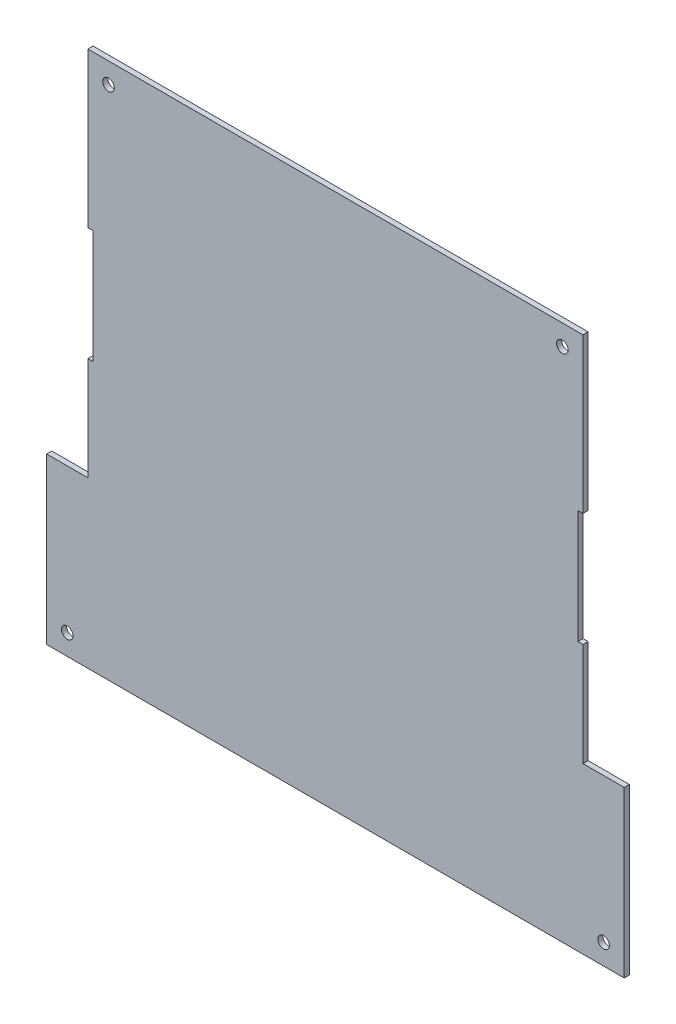
ISO-10303-21;
HEADER;
FILE_DESCRIPTION(('STEP AP214'),'2;1');
FILE_NAME('part.step','',(''),(''),'','','');
FILE_SCHEMA(('AUTOMOTIVE_DESIGN { 1 0 10303 214 1 1 1 1 }'));
ENDSEC;
DATA;
#1=APPLICATION_CONTEXT('core data for automotive mechanical design processes');
#2=APPLICATION_PROTOCOL_DEFINITION('international standard','automotive_design',2000,#1);
#3=PRODUCT_CONTEXT('',#1,'mechanical');
#4=PRODUCT('Part','Part','',(#3));
#5=PRODUCT_RELATED_PRODUCT_CATEGORY('part','',(#4));
#6=PRODUCT_DEFINITION_FORMATION('','',#4);
#7=PRODUCT_DEFINITION_CONTEXT('part definition',#1,'design');
#8=PRODUCT_DEFINITION('design','',#6,#7);
#9=PRODUCT_DEFINITION_SHAPE('','',#8);
#10=(LENGTH_UNIT() NAMED_UNIT(*) SI_UNIT(.MILLI.,.METRE.));
#11=(NAMED_UNIT(*) PLANE_ANGLE_UNIT() SI_UNIT($,.RADIAN.));
#12=(NAMED_UNIT(*) SI_UNIT($,.STERADIAN.) SOLID_ANGLE_UNIT());
#13=UNCERTAINTY_MEASURE_WITH_UNIT(LENGTH_MEASURE(1.E-05),#10,'distance_accuracy_value','');
#14=(GEOMETRIC_REPRESENTATION_CONTEXT(3) GLOBAL_UNCERTAINTY_ASSIGNED_CONTEXT((#13)) GLOBAL_UNIT_ASSIGNED_CONTEXT((#10,
#11,#12)) REPRESENTATION_CONTEXT('',''));
#15=CARTESIAN_POINT('',(0.,0.,0.));
#16=DIRECTION('',(0.,0.,1.));
#17=DIRECTION('',(1.,0.,0.));
#18=AXIS2_PLACEMENT_3D('',#15,#16,#17);
#19=CARTESIAN_POINT('',(0.,0.,3.175));
#20=DIRECTION('',(1.,0.,0.));
#21=DIRECTION('',(0.,1.,0.));
#22=AXIS2_PLACEMENT_3D('',#19,#20,#21);
#23=PLANE('',#22);
#24=DIRECTION('',(0.,-1.,0.));
#25=VECTOR('',#24,1.);
#26=CARTESIAN_POINT('',(0.,0.,0.));
#27=LINE('',#26,#25);
#28=CARTESIAN_POINT('',(0.,0.,0.));
#29=VERTEX_POINT('',#28);
#30=CARTESIAN_POINT('',(0.,-95.25,0.));
#31=VERTEX_POINT('',#30);
#32=EDGE_CURVE('E341',#29,#31,#27,.T.);
#33=ORIENTED_EDGE('',*,*,#32,.T.);
#34=DIRECTION('',(0.,0.,1.));
#35=VECTOR('',#34,1.);
#36=CARTESIAN_POINT('',(0.,-95.25,-0.00100000000000013));
#37=LINE('',#36,#35);
#38=CARTESIAN_POINT('',(0.,-95.25,3.175));
#39=VERTEX_POINT('',#38);
#40=EDGE_CURVE('E264',#31,#39,#37,.T.);
#41=ORIENTED_EDGE('',*,*,#40,.T.);
#42=DIRECTION('',(0.,-1.,0.));
#43=VECTOR('',#42,1.);
#44=CARTESIAN_POINT('',(0.,0.,3.175));
#45=LINE('',#44,#43);
#46=CARTESIAN_POINT('',(0.,0.,3.175));
#47=VERTEX_POINT('',#46);
#48=EDGE_CURVE('E328',#47,#39,#45,.T.);
#49=ORIENTED_EDGE('',*,*,#48,.F.);
#50=DIRECTION('',(0.,0.,-1.));
#51=VECTOR('',#50,1.);
#52=CARTESIAN_POINT('',(0.,0.,3.175));
#53=LINE('',#52,#51);
#54=EDGE_CURVE('E60',#47,#29,#53,.T.);
#55=ORIENTED_EDGE('',*,*,#54,.T.);
#56=EDGE_LOOP('',(#33,#41,#49,#55));
#57=FACE_BOUND('',#56,.T.);
#58=ADVANCED_FACE('F51',(#57),#23,.F.);
#59=CARTESIAN_POINT('',(304.8,0.,3.175));
#60=DIRECTION('',(-1.,0.,0.));
#61=DIRECTION('',(0.,-1.,0.));
#62=AXIS2_PLACEMENT_3D('',#59,#60,#61);
#63=PLANE('',#62);
#64=DIRECTION('',(0.,1.,0.));
#65=VECTOR('',#64,1.);
#66=CARTESIAN_POINT('',(304.8,0.,3.175));
#67=LINE('',#66,#65);
#68=CARTESIAN_POINT('',(304.8,-228.6,3.175));
#69=VERTEX_POINT('',#68);
#70=CARTESIAN_POINT('',(304.8,-165.1,3.175));
#71=VERTEX_POINT('',#70);
#72=EDGE_CURVE('E67',#69,#71,#67,.T.);
#73=ORIENTED_EDGE('',*,*,#72,.F.);
#74=DIRECTION('',(0.,0.,1.));
#75=VECTOR('',#74,1.);
#76=CARTESIAN_POINT('',(304.8,-228.6,-104.726882890689));
#77=LINE('',#76,#75);
#78=CARTESIAN_POINT('',(304.8,-228.6,0.));
#79=VERTEX_POINT('',#78);
#80=EDGE_CURVE('E230',#79,#69,#77,.T.);
#81=ORIENTED_EDGE('',*,*,#80,.F.);
#82=DIRECTION('',(0.,1.,0.));
#83=VECTOR('',#82,1.);
#84=CARTESIAN_POINT('',(304.8,0.,0.));
#85=LINE('',#84,#83);
#86=CARTESIAN_POINT('',(304.8,-165.1,0.));
#87=VERTEX_POINT('',#86);
#88=EDGE_CURVE('E349',#79,#87,#85,.T.);
#89=ORIENTED_EDGE('',*,*,#88,.T.);
#90=DIRECTION('',(0.,0.,1.));
#91=VECTOR('',#90,1.);
#92=CARTESIAN_POINT('',(304.8,-165.1,-0.00100000000000013));
#93=LINE('',#92,#91);
#94=EDGE_CURVE('E282',#87,#71,#93,.T.);
#95=ORIENTED_EDGE('',*,*,#94,.T.);
#96=EDGE_LOOP('',(#73,#81,#89,#95));
#97=FACE_BOUND('',#96,.T.);
#98=ADVANCED_FACE('F515',(#97),#63,.F.);
#99=CARTESIAN_POINT('',(0.,-165.1,0.));
#100=VERTEX_POINT('',#99);
#101=CARTESIAN_POINT('',(0.,-228.6,0.));
#102=VERTEX_POINT('',#101);
#103=EDGE_CURVE('E327',#100,#102,#27,.T.);
#104=ORIENTED_EDGE('',*,*,#103,.T.);
#105=DIRECTION('',(0.,0.,1.));
#106=VECTOR('',#105,1.);
#107=CARTESIAN_POINT('',(0.,-228.6,-104.726882890689));
#108=LINE('',#107,#106);
#109=CARTESIAN_POINT('',(0.,-228.6,3.175));
#110=VERTEX_POINT('',#109);
#111=EDGE_CURVE('E75',#102,#110,#108,.T.);
#112=ORIENTED_EDGE('',*,*,#111,.T.);
#113=CARTESIAN_POINT('',(0.,-165.1,3.175));
#114=VERTEX_POINT('',#113);
#115=EDGE_CURVE('E202',#114,#110,#45,.T.);
#116=ORIENTED_EDGE('',*,*,#115,.F.);
#117=DIRECTION('',(0.,0.,1.));
#118=VECTOR('',#117,1.);
#119=CARTESIAN_POINT('',(0.,-165.1,-0.00100000000000013));
#120=LINE('',#119,#118);
#121=EDGE_CURVE('E263',#100,#114,#120,.T.);
#122=ORIENTED_EDGE('',*,*,#121,.F.);
#123=EDGE_LOOP('',(#104,#112,#116,#122));
#124=FACE_BOUND('',#123,.T.);
#125=ADVANCED_FACE('F53',(#124),#23,.F.);
#126=CARTESIAN_POINT('',(0.,-330.2,3.175));
#127=DIRECTION('',(0.,1.,0.));
#128=DIRECTION('',(0.,0.,1.));
#129=AXIS2_PLACEMENT_3D('',#126,#127,#128);
#130=PLANE('',#129);
#131=DIRECTION('',(1.,0.,0.));
#132=VECTOR('',#131,1.);
#133=CARTESIAN_POINT('',(0.,-330.2,0.));
#134=LINE('',#133,#132);
#135=CARTESIAN_POINT('',(-25.4,-330.2,0.));
#136=VERTEX_POINT('',#135);
#137=CARTESIAN_POINT('',(330.2,-330.2,0.));
#138=VERTEX_POINT('',#137);
#139=EDGE_CURVE('E345',#136,#138,#134,.T.);
#140=ORIENTED_EDGE('',*,*,#139,.T.);
#141=DIRECTION('',(0.,0.,1.));
#142=VECTOR('',#141,1.);
#143=CARTESIAN_POINT('',(330.2,-330.2,-104.726882890689));
#144=LINE('',#143,#142);
#145=CARTESIAN_POINT('',(330.2,-330.2,3.175));
#146=VERTEX_POINT('',#145);
#147=EDGE_CURVE('E223',#138,#146,#144,.T.);
#148=ORIENTED_EDGE('',*,*,#147,.T.);
#149=DIRECTION('',(1.,0.,0.));
#150=VECTOR('',#149,1.);
#151=CARTESIAN_POINT('',(0.,-330.2,3.175));
#152=LINE('',#151,#150);
#153=CARTESIAN_POINT('',(-25.4,-330.2,3.175));
#154=VERTEX_POINT('',#153);
#155=EDGE_CURVE('E332',#154,#146,#152,.T.);
#156=ORIENTED_EDGE('',*,*,#155,.F.);
#157=DIRECTION('',(0.,0.,1.));
#158=VECTOR('',#157,1.);
#159=CARTESIAN_POINT('',(-25.4,-330.2,-104.726882890689));
#160=LINE('',#159,#158);
#161=EDGE_CURVE('E188',#136,#154,#160,.T.);
#162=ORIENTED_EDGE('',*,*,#161,.F.);
#163=EDGE_LOOP('',(#140,#148,#156,#162));
#164=FACE_BOUND('',#163,.T.);
#165=ADVANCED_FACE('F523',(#164),#130,.F.);
#166=CARTESIAN_POINT('',(304.8,-95.25,3.175));
#167=VERTEX_POINT('',#166);
#168=CARTESIAN_POINT('',(304.8,0.,3.175));
#169=VERTEX_POINT('',#168);
#170=EDGE_CURVE('E335',#167,#169,#67,.T.);
#171=ORIENTED_EDGE('',*,*,#170,.F.);
#172=DIRECTION('',(0.,0.,1.));
#173=VECTOR('',#172,1.);
#174=CARTESIAN_POINT('',(304.8,-95.25,-0.00100000000000013));
#175=LINE('',#174,#173);
#176=CARTESIAN_POINT('',(304.8,-95.25,0.));
#177=VERTEX_POINT('',#176);
#178=EDGE_CURVE('E283',#177,#167,#175,.T.);
#179=ORIENTED_EDGE('',*,*,#178,.F.);
#180=CARTESIAN_POINT('',(304.8,0.,0.));
#181=VERTEX_POINT('',#180);
#182=EDGE_CURVE('E348',#177,#181,#85,.T.);
#183=ORIENTED_EDGE('',*,*,#182,.T.);
#184=DIRECTION('',(0.,0.,-1.));
#185=VECTOR('',#184,1.);
#186=CARTESIAN_POINT('',(304.8,0.,3.175));
#187=LINE('',#186,#185);
#188=EDGE_CURVE('E11',#169,#181,#187,.T.);
#189=ORIENTED_EDGE('',*,*,#188,.F.);
#190=EDGE_LOOP('',(#171,#179,#183,#189));
#191=FACE_BOUND('',#190,.T.);
#192=ADVANCED_FACE('F379',(#191),#63,.F.);
#193=CARTESIAN_POINT('',(0.,0.,3.175));
#194=DIRECTION('',(0.,-1.,0.));
#195=DIRECTION('',(0.,0.,-1.));
#196=AXIS2_PLACEMENT_3D('',#193,#194,#195);
#197=PLANE('',#196);
#198=DIRECTION('',(-1.,0.,0.));
#199=VECTOR('',#198,1.);
#200=CARTESIAN_POINT('',(0.,0.,0.));
#201=LINE('',#200,#199);
#202=EDGE_CURVE('E352',#181,#29,#201,.T.);
#203=ORIENTED_EDGE('',*,*,#202,.T.);
#204=ORIENTED_EDGE('',*,*,#54,.F.);
#205=DIRECTION('',(-1.,0.,0.));
#206=VECTOR('',#205,1.);
#207=CARTESIAN_POINT('',(0.,0.,3.175));
#208=LINE('',#207,#206);
#209=EDGE_CURVE('E338',#169,#47,#208,.T.);
#210=ORIENTED_EDGE('',*,*,#209,.F.);
#211=ORIENTED_EDGE('',*,*,#188,.T.);
#212=EDGE_LOOP('',(#203,#204,#210,#211));
#213=FACE_BOUND('',#212,.T.);
#214=ADVANCED_FACE('F377',(#213),#197,.F.);
#215=CARTESIAN_POINT('',(0.,0.,3.175));
#216=DIRECTION('',(0.,0.,1.));
#217=DIRECTION('',(1.,0.,0.));
#218=AXIS2_PLACEMENT_3D('',#215,#216,#217);
#219=PLANE('',#218);
#220=CARTESIAN_POINT('',(-12.7,-317.5,3.175));
#221=DIRECTION('',(0.,0.,1.));
#222=DIRECTION('',(1.,0.,0.));
#223=AXIS2_PLACEMENT_3D('',#220,#221,#222);
#224=CIRCLE('',#223,3.57123999999999);
#225=CARTESIAN_POINT('',(-9.12876000000001,-317.5,3.175));
#226=VERTEX_POINT('',#225);
#227=EDGE_CURVE('E484',#226,#226,#224,.T.);
#228=ORIENTED_EDGE('',*,*,#227,.F.);
#229=EDGE_LOOP('',(#228));
#230=FACE_BOUND('',#229,.T.);
#231=CARTESIAN_POINT('',(317.5,-317.5,3.175));
#232=DIRECTION('',(0.,0.,1.));
#233=DIRECTION('',(1.,0.,0.));
#234=AXIS2_PLACEMENT_3D('',#231,#232,#233);
#235=CIRCLE('',#234,3.57123999999998);
#236=CARTESIAN_POINT('',(321.07124,-317.5,3.175));
#237=VERTEX_POINT('',#236);
#238=EDGE_CURVE('E473',#237,#237,#235,.T.);
#239=ORIENTED_EDGE('',*,*,#238,.F.);
#240=EDGE_LOOP('',(#239));
#241=FACE_BOUND('',#240,.T.);
#242=DIRECTION('',(-1.,0.,0.));
#243=VECTOR('',#242,1.);
#244=CARTESIAN_POINT('',(3.17500000000001,-95.25,3.175));
#245=LINE('',#244,#243);
#246=CARTESIAN_POINT('',(3.17500000000001,-95.25,3.175));
#247=VERTEX_POINT('',#246);
#248=EDGE_CURVE('E260',#247,#39,#245,.T.);
#249=ORIENTED_EDGE('',*,*,#248,.F.);
#250=DIRECTION('',(0.,1.,0.));
#251=VECTOR('',#250,1.);
#252=CARTESIAN_POINT('',(3.17500000000001,-165.1,3.175));
#253=LINE('',#252,#251);
#254=CARTESIAN_POINT('',(3.17500000000001,-165.1,3.175));
#255=VERTEX_POINT('',#254);
#256=EDGE_CURVE('E256',#255,#247,#253,.T.);
#257=ORIENTED_EDGE('',*,*,#256,.F.);
#258=DIRECTION('',(1.,0.,0.));
#259=VECTOR('',#258,1.);
#260=CARTESIAN_POINT('',(3.17500000000001,-165.1,3.175));
#261=LINE('',#260,#259);
#262=EDGE_CURVE('E252',#114,#255,#261,.T.);
#263=ORIENTED_EDGE('',*,*,#262,.F.);
#264=ORIENTED_EDGE('',*,*,#115,.T.);
#265=DIRECTION('',(-1.,0.,0.));
#266=VECTOR('',#265,1.);
#267=CARTESIAN_POINT('',(0.,-228.6,3.175));
#268=LINE('',#267,#266);
#269=CARTESIAN_POINT('',(-25.4,-228.6,3.175));
#270=VERTEX_POINT('',#269);
#271=EDGE_CURVE('E182',#110,#270,#268,.T.);
#272=ORIENTED_EDGE('',*,*,#271,.T.);
#273=DIRECTION('',(0.,-1.,0.));
#274=VECTOR('',#273,1.);
#275=CARTESIAN_POINT('',(-25.4,-330.2,3.175));
#276=LINE('',#275,#274);
#277=EDGE_CURVE('E192',#270,#154,#276,.T.);
#278=ORIENTED_EDGE('',*,*,#277,.T.);
#279=ORIENTED_EDGE('',*,*,#155,.T.);
#280=DIRECTION('',(0.,1.,0.));
#281=VECTOR('',#280,1.);
#282=CARTESIAN_POINT('',(330.2,-330.2,3.175));
#283=LINE('',#282,#281);
#284=CARTESIAN_POINT('',(330.2,-228.6,3.175));
#285=VERTEX_POINT('',#284);
#286=EDGE_CURVE('E204',#146,#285,#283,.T.);
#287=ORIENTED_EDGE('',*,*,#286,.T.);
#288=DIRECTION('',(-1.,0.,0.));
#289=VECTOR('',#288,1.);
#290=CARTESIAN_POINT('',(304.8,-228.6,3.175));
#291=LINE('',#290,#289);
#292=EDGE_CURVE('E210',#285,#69,#291,.T.);
#293=ORIENTED_EDGE('',*,*,#292,.T.);
#294=ORIENTED_EDGE('',*,*,#72,.T.);
#295=DIRECTION('',(1.,0.,0.));
#296=VECTOR('',#295,1.);
#297=CARTESIAN_POINT('',(301.625,-165.1,3.175));
#298=LINE('',#297,#296);
#299=CARTESIAN_POINT('',(301.625,-165.1,3.175));
#300=VERTEX_POINT('',#299);
#301=EDGE_CURVE('E286',#300,#71,#298,.T.);
#302=ORIENTED_EDGE('',*,*,#301,.F.);
#303=DIRECTION('',(0.,-1.,0.));
#304=VECTOR('',#303,1.);
#305=CARTESIAN_POINT('',(301.625,-165.1,3.175));
#306=LINE('',#305,#304);
#307=CARTESIAN_POINT('',(301.625,-95.25,3.175));
#308=VERTEX_POINT('',#307);
#309=EDGE_CURVE('E298',#308,#300,#306,.T.);
#310=ORIENTED_EDGE('',*,*,#309,.F.);
#311=DIRECTION('',(-1.,0.,0.));
#312=VECTOR('',#311,1.);
#313=CARTESIAN_POINT('',(301.625,-95.25,3.175));
#314=LINE('',#313,#312);
#315=EDGE_CURVE('E302',#167,#308,#314,.T.);
#316=ORIENTED_EDGE('',*,*,#315,.F.);
#317=ORIENTED_EDGE('',*,*,#170,.T.);
#318=ORIENTED_EDGE('',*,*,#209,.T.);
#319=ORIENTED_EDGE('',*,*,#48,.T.);
#320=EDGE_LOOP('',(#249,#257,#263,#264,#272,#278,#279,#287,#293,#294,#302,#310,#316,#317,#318,#319));
#321=FACE_BOUND('',#320,.T.);
#322=CARTESIAN_POINT('',(12.7,-12.7000000000001,3.175));
#323=DIRECTION('',(0.,0.,1.));
#324=DIRECTION('',(1.,0.,0.));
#325=AXIS2_PLACEMENT_3D('',#322,#323,#324);
#326=CIRCLE('',#325,3.57123999999999);
#327=CARTESIAN_POINT('',(16.27124,-12.7000000000001,3.175));
#328=VERTEX_POINT('',#327);
#329=EDGE_CURVE('E279',#328,#328,#326,.T.);
#330=ORIENTED_EDGE('',*,*,#329,.F.);
#331=EDGE_LOOP('',(#330));
#332=FACE_BOUND('',#331,.T.);
#333=CARTESIAN_POINT('',(292.1,-12.7,3.175));
#334=DIRECTION('',(0.,0.,1.));
#335=DIRECTION('',(1.,0.,0.));
#336=AXIS2_PLACEMENT_3D('',#333,#334,#335);
#337=CIRCLE('',#336,3.57123999999998);
#338=CARTESIAN_POINT('',(295.67124,-12.7,3.175));
#339=VERTEX_POINT('',#338);
#340=EDGE_CURVE('E319',#339,#339,#337,.T.);
#341=ORIENTED_EDGE('',*,*,#340,.F.);
#342=EDGE_LOOP('',(#341));
#343=FACE_BOUND('',#342,.T.);
#344=ADVANCED_FACE('F199',(#230,#241,#321,#332,#343),#219,.T.);
#345=CARTESIAN_POINT('',(0.,0.,0.));
#346=DIRECTION('',(0.,0.,1.));
#347=DIRECTION('',(1.,0.,0.));
#348=AXIS2_PLACEMENT_3D('',#345,#346,#347);
#349=PLANE('',#348);
#350=CARTESIAN_POINT('',(-12.7,-317.5,0.));
#351=DIRECTION('',(0.,0.,1.));
#352=DIRECTION('',(1.,0.,0.));
#353=AXIS2_PLACEMENT_3D('',#350,#351,#352);
#354=CIRCLE('',#353,3.57123999999999);
#355=CARTESIAN_POINT('',(-9.12876000000001,-317.5,0.));
#356=VERTEX_POINT('',#355);
#357=EDGE_CURVE('E478',#356,#356,#354,.T.);
#358=ORIENTED_EDGE('',*,*,#357,.T.);
#359=EDGE_LOOP('',(#358));
#360=FACE_BOUND('',#359,.T.);
#361=CARTESIAN_POINT('',(317.5,-317.5,0.));
#362=DIRECTION('',(0.,0.,1.));
#363=DIRECTION('',(1.,0.,0.));
#364=AXIS2_PLACEMENT_3D('',#361,#362,#363);
#365=CIRCLE('',#364,3.57123999999998);
#366=CARTESIAN_POINT('',(321.07124,-317.5,0.));
#367=VERTEX_POINT('',#366);
#368=EDGE_CURVE('E240',#367,#367,#365,.T.);
#369=ORIENTED_EDGE('',*,*,#368,.T.);
#370=EDGE_LOOP('',(#369));
#371=FACE_BOUND('',#370,.T.);
#372=CARTESIAN_POINT('',(12.7,-12.7000000000001,0.));
#373=DIRECTION('',(0.,0.,1.));
#374=DIRECTION('',(1.,0.,0.));
#375=AXIS2_PLACEMENT_3D('',#372,#373,#374);
#376=CIRCLE('',#375,3.57123999999999);
#377=CARTESIAN_POINT('',(16.27124,-12.7000000000001,0.));
#378=VERTEX_POINT('',#377);
#379=EDGE_CURVE('E315',#378,#378,#376,.T.);
#380=ORIENTED_EDGE('',*,*,#379,.T.);
#381=EDGE_LOOP('',(#380));
#382=FACE_BOUND('',#381,.T.);
#383=CARTESIAN_POINT('',(292.1,-12.7,0.));
#384=DIRECTION('',(0.,0.,1.));
#385=DIRECTION('',(1.,0.,0.));
#386=AXIS2_PLACEMENT_3D('',#383,#384,#385);
#387=CIRCLE('',#386,3.57123999999998);
#388=CARTESIAN_POINT('',(295.67124,-12.7,0.));
#389=VERTEX_POINT('',#388);
#390=EDGE_CURVE('E323',#389,#389,#387,.T.);
#391=ORIENTED_EDGE('',*,*,#390,.T.);
#392=EDGE_LOOP('',(#391));
#393=FACE_BOUND('',#392,.T.);
#394=DIRECTION('',(0.,-1.,0.));
#395=VECTOR('',#394,1.);
#396=CARTESIAN_POINT('',(3.17500000000001,-165.1,0.));
#397=LINE('',#396,#395);
#398=CARTESIAN_POINT('',(3.17500000000001,-95.25,0.));
#399=VERTEX_POINT('',#398);
#400=CARTESIAN_POINT('',(3.17500000000001,-165.1,0.));
#401=VERTEX_POINT('',#400);
#402=EDGE_CURVE('E244',#399,#401,#397,.T.);
#403=ORIENTED_EDGE('',*,*,#402,.F.);
#404=DIRECTION('',(1.,0.,0.));
#405=VECTOR('',#404,1.);
#406=CARTESIAN_POINT('',(3.17500000000001,-95.25,0.));
#407=LINE('',#406,#405);
#408=EDGE_CURVE('E247',#31,#399,#407,.T.);
#409=ORIENTED_EDGE('',*,*,#408,.F.);
#410=ORIENTED_EDGE('',*,*,#32,.F.);
#411=ORIENTED_EDGE('',*,*,#202,.F.);
#412=ORIENTED_EDGE('',*,*,#182,.F.);
#413=DIRECTION('',(1.,0.,0.));
#414=VECTOR('',#413,1.);
#415=CARTESIAN_POINT('',(301.625,-95.25,0.));
#416=LINE('',#415,#414);
#417=CARTESIAN_POINT('',(301.625,-95.25,0.));
#418=VERTEX_POINT('',#417);
#419=EDGE_CURVE('E222',#418,#177,#416,.T.);
#420=ORIENTED_EDGE('',*,*,#419,.F.);
#421=DIRECTION('',(0.,1.,0.));
#422=VECTOR('',#421,1.);
#423=CARTESIAN_POINT('',(301.625,-165.1,0.));
#424=LINE('',#423,#422);
#425=CARTESIAN_POINT('',(301.625,-165.1,0.));
#426=VERTEX_POINT('',#425);
#427=EDGE_CURVE('E248',#426,#418,#424,.T.);
#428=ORIENTED_EDGE('',*,*,#427,.F.);
#429=DIRECTION('',(-1.,0.,0.));
#430=VECTOR('',#429,1.);
#431=CARTESIAN_POINT('',(301.625,-165.1,0.));
#432=LINE('',#431,#430);
#433=EDGE_CURVE('E306',#87,#426,#432,.T.);
#434=ORIENTED_EDGE('',*,*,#433,.F.);
#435=ORIENTED_EDGE('',*,*,#88,.F.);
#436=DIRECTION('',(1.,0.,0.));
#437=VECTOR('',#436,1.);
#438=CARTESIAN_POINT('',(304.8,-228.6,0.));
#439=LINE('',#438,#437);
#440=CARTESIAN_POINT('',(330.2,-228.6,0.));
#441=VERTEX_POINT('',#440);
#442=EDGE_CURVE('E237',#79,#441,#439,.T.);
#443=ORIENTED_EDGE('',*,*,#442,.T.);
#444=DIRECTION('',(0.,-1.,0.));
#445=VECTOR('',#444,1.);
#446=CARTESIAN_POINT('',(330.2,-330.2,0.));
#447=LINE('',#446,#445);
#448=EDGE_CURVE('E233',#441,#138,#447,.T.);
#449=ORIENTED_EDGE('',*,*,#448,.T.);
#450=ORIENTED_EDGE('',*,*,#139,.F.);
#451=DIRECTION('',(0.,1.,0.));
#452=VECTOR('',#451,1.);
#453=CARTESIAN_POINT('',(-25.4,-330.2,0.));
#454=LINE('',#453,#452);
#455=CARTESIAN_POINT('',(-25.4,-228.6,0.));
#456=VERTEX_POINT('',#455);
#457=EDGE_CURVE('E213',#136,#456,#454,.T.);
#458=ORIENTED_EDGE('',*,*,#457,.T.);
#459=DIRECTION('',(1.,0.,0.));
#460=VECTOR('',#459,1.);
#461=CARTESIAN_POINT('',(0.,-228.6,0.));
#462=LINE('',#461,#460);
#463=EDGE_CURVE('E184',#456,#102,#462,.T.);
#464=ORIENTED_EDGE('',*,*,#463,.T.);
#465=ORIENTED_EDGE('',*,*,#103,.F.);
#466=DIRECTION('',(-1.,0.,0.));
#467=VECTOR('',#466,1.);
#468=CARTESIAN_POINT('',(3.17500000000001,-165.1,0.));
#469=LINE('',#468,#467);
#470=EDGE_CURVE('E268',#401,#100,#469,.T.);
#471=ORIENTED_EDGE('',*,*,#470,.F.);
#472=EDGE_LOOP('',(#403,#409,#410,#411,#412,#420,#428,#434,#435,#443,#449,#450,#458,#464,#465,#471));
#473=FACE_BOUND('',#472,.T.);
#474=ADVANCED_FACE('F368',(#360,#371,#382,#393,#473),#349,.F.);
#475=CARTESIAN_POINT('',(292.1,-12.7,3.175));
#476=DIRECTION('',(0.,0.,1.));
#477=DIRECTION('',(1.,0.,0.));
#478=AXIS2_PLACEMENT_3D('',#475,#476,#477);
#479=CYLINDRICAL_SURFACE('',#478,3.57123999999998);
#480=ORIENTED_EDGE('',*,*,#390,.F.);
#481=EDGE_LOOP('',(#480));
#482=FACE_BOUND('',#481,.T.);
#483=ORIENTED_EDGE('',*,*,#340,.T.);
#484=EDGE_LOOP('',(#483));
#485=FACE_BOUND('',#484,.T.);
#486=ADVANCED_FACE('F568',(#482,#485),#479,.F.);
#487=CARTESIAN_POINT('',(12.7,-12.7000000000001,3.175));
#488=DIRECTION('',(0.,0.,1.));
#489=DIRECTION('',(1.,0.,0.));
#490=AXIS2_PLACEMENT_3D('',#487,#488,#489);
#491=CYLINDRICAL_SURFACE('',#490,3.57123999999999);
#492=ORIENTED_EDGE('',*,*,#379,.F.);
#493=EDGE_LOOP('',(#492));
#494=FACE_BOUND('',#493,.T.);
#495=ORIENTED_EDGE('',*,*,#329,.T.);
#496=EDGE_LOOP('',(#495));
#497=FACE_BOUND('',#496,.T.);
#498=ADVANCED_FACE('F566',(#494,#497),#491,.F.);
#499=CARTESIAN_POINT('',(301.625,-165.1,-0.00100000000000013));
#500=DIRECTION('',(0.,-1.,0.));
#501=DIRECTION('',(0.,0.,-1.));
#502=AXIS2_PLACEMENT_3D('',#499,#500,#501);
#503=PLANE('',#502);
#504=ORIENTED_EDGE('',*,*,#433,.T.);
#505=DIRECTION('',(0.,0.,1.));
#506=VECTOR('',#505,1.);
#507=CARTESIAN_POINT('',(301.625,-165.1,-0.00100000000000013));
#508=LINE('',#507,#506);
#509=EDGE_CURVE('E290',#426,#300,#508,.T.);
#510=ORIENTED_EDGE('',*,*,#509,.T.);
#511=ORIENTED_EDGE('',*,*,#301,.T.);
#512=ORIENTED_EDGE('',*,*,#94,.F.);
#513=EDGE_LOOP('',(#504,#510,#511,#512));
#514=FACE_BOUND('',#513,.T.);
#515=ADVANCED_FACE('F542',(#514),#503,.F.);
#516=CARTESIAN_POINT('',(301.625,-165.1,-0.00100000000000013));
#517=DIRECTION('',(-1.,0.,0.));
#518=DIRECTION('',(0.,-1.,0.));
#519=AXIS2_PLACEMENT_3D('',#516,#517,#518);
#520=PLANE('',#519);
#521=ORIENTED_EDGE('',*,*,#427,.T.);
#522=DIRECTION('',(0.,0.,1.));
#523=VECTOR('',#522,1.);
#524=CARTESIAN_POINT('',(301.625,-95.25,-0.00100000000000013));
#525=LINE('',#524,#523);
#526=EDGE_CURVE('E287',#418,#308,#525,.T.);
#527=ORIENTED_EDGE('',*,*,#526,.T.);
#528=ORIENTED_EDGE('',*,*,#309,.T.);
#529=ORIENTED_EDGE('',*,*,#509,.F.);
#530=EDGE_LOOP('',(#521,#527,#528,#529));
#531=FACE_BOUND('',#530,.T.);
#532=ADVANCED_FACE('F547',(#531),#520,.F.);
#533=CARTESIAN_POINT('',(301.625,-95.25,-0.00100000000000013));
#534=DIRECTION('',(0.,1.,0.));
#535=DIRECTION('',(0.,0.,1.));
#536=AXIS2_PLACEMENT_3D('',#533,#534,#535);
#537=PLANE('',#536);
#538=ORIENTED_EDGE('',*,*,#419,.T.);
#539=ORIENTED_EDGE('',*,*,#178,.T.);
#540=ORIENTED_EDGE('',*,*,#315,.T.);
#541=ORIENTED_EDGE('',*,*,#526,.F.);
#542=EDGE_LOOP('',(#538,#539,#540,#541));
#543=FACE_BOUND('',#542,.T.);
#544=ADVANCED_FACE('F549',(#543),#537,.F.);
#545=CARTESIAN_POINT('',(3.17500000000001,-95.25,-0.00100000000000013));
#546=DIRECTION('',(0.,1.,0.));
#547=DIRECTION('',(0.,0.,1.));
#548=AXIS2_PLACEMENT_3D('',#545,#546,#547);
#549=PLANE('',#548);
#550=ORIENTED_EDGE('',*,*,#408,.T.);
#551=DIRECTION('',(0.,0.,1.));
#552=VECTOR('',#551,1.);
#553=CARTESIAN_POINT('',(3.17500000000001,-95.25,-0.00100000000000013));
#554=LINE('',#553,#552);
#555=EDGE_CURVE('E269',#399,#247,#554,.T.);
#556=ORIENTED_EDGE('',*,*,#555,.T.);
#557=ORIENTED_EDGE('',*,*,#248,.T.);
#558=ORIENTED_EDGE('',*,*,#40,.F.);
#559=EDGE_LOOP('',(#550,#556,#557,#558));
#560=FACE_BOUND('',#559,.T.);
#561=ADVANCED_FACE('F372',(#560),#549,.F.);
#562=CARTESIAN_POINT('',(3.17500000000001,-165.1,-0.00100000000000013));
#563=DIRECTION('',(1.,0.,0.));
#564=DIRECTION('',(0.,0.,-1.));
#565=AXIS2_PLACEMENT_3D('',#562,#563,#564);
#566=PLANE('',#565);
#567=ORIENTED_EDGE('',*,*,#402,.T.);
#568=DIRECTION('',(0.,0.,1.));
#569=VECTOR('',#568,1.);
#570=CARTESIAN_POINT('',(3.17500000000001,-165.1,-0.00100000000000013));
#571=LINE('',#570,#569);
#572=EDGE_CURVE('E272',#401,#255,#571,.T.);
#573=ORIENTED_EDGE('',*,*,#572,.T.);
#574=ORIENTED_EDGE('',*,*,#256,.T.);
#575=ORIENTED_EDGE('',*,*,#555,.F.);
#576=EDGE_LOOP('',(#567,#573,#574,#575));
#577=FACE_BOUND('',#576,.T.);
#578=ADVANCED_FACE('F557',(#577),#566,.F.);
#579=CARTESIAN_POINT('',(3.17500000000001,-165.1,-0.00100000000000013));
#580=DIRECTION('',(0.,-1.,0.));
#581=DIRECTION('',(0.,0.,-1.));
#582=AXIS2_PLACEMENT_3D('',#579,#580,#581);
#583=PLANE('',#582);
#584=ORIENTED_EDGE('',*,*,#470,.T.);
#585=ORIENTED_EDGE('',*,*,#121,.T.);
#586=ORIENTED_EDGE('',*,*,#262,.T.);
#587=ORIENTED_EDGE('',*,*,#572,.F.);
#588=EDGE_LOOP('',(#584,#585,#586,#587));
#589=FACE_BOUND('',#588,.T.);
#590=ADVANCED_FACE('F561',(#589),#583,.F.);
#591=CARTESIAN_POINT('',(304.8,-228.6,-104.726882890689));
#592=DIRECTION('',(0.,1.,0.));
#593=DIRECTION('',(-1.,0.,0.));
#594=AXIS2_PLACEMENT_3D('',#591,#592,#593);
#595=PLANE('',#594);
#596=ORIENTED_EDGE('',*,*,#442,.F.);
#597=ORIENTED_EDGE('',*,*,#80,.T.);
#598=ORIENTED_EDGE('',*,*,#292,.F.);
#599=DIRECTION('',(0.,0.,1.));
#600=VECTOR('',#599,1.);
#601=CARTESIAN_POINT('',(330.2,-228.6,-104.726882890689));
#602=LINE('',#601,#600);
#603=EDGE_CURVE('E227',#441,#285,#602,.T.);
#604=ORIENTED_EDGE('',*,*,#603,.F.);
#605=EDGE_LOOP('',(#596,#597,#598,#604));
#606=FACE_BOUND('',#605,.T.);
#607=ADVANCED_FACE('F538',(#606),#595,.T.);
#608=CARTESIAN_POINT('',(330.2,-330.2,-104.726882890689));
#609=DIRECTION('',(1.,0.,0.));
#610=DIRECTION('',(0.,1.,0.));
#611=AXIS2_PLACEMENT_3D('',#608,#609,#610);
#612=PLANE('',#611);
#613=ORIENTED_EDGE('',*,*,#448,.F.);
#614=ORIENTED_EDGE('',*,*,#603,.T.);
#615=ORIENTED_EDGE('',*,*,#286,.F.);
#616=ORIENTED_EDGE('',*,*,#147,.F.);
#617=EDGE_LOOP('',(#613,#614,#615,#616));
#618=FACE_BOUND('',#617,.T.);
#619=ADVANCED_FACE('F601',(#618),#612,.T.);
#620=CARTESIAN_POINT('',(-25.4,-330.2,-104.726882890689));
#621=DIRECTION('',(-1.,0.,0.));
#622=DIRECTION('',(0.,-1.,0.));
#623=AXIS2_PLACEMENT_3D('',#620,#621,#622);
#624=PLANE('',#623);
#625=ORIENTED_EDGE('',*,*,#457,.F.);
#626=ORIENTED_EDGE('',*,*,#161,.T.);
#627=ORIENTED_EDGE('',*,*,#277,.F.);
#628=DIRECTION('',(0.,0.,1.));
#629=VECTOR('',#628,1.);
#630=CARTESIAN_POINT('',(-25.4,-228.6,-104.726882890689));
#631=LINE('',#630,#629);
#632=EDGE_CURVE('E178',#456,#270,#631,.T.);
#633=ORIENTED_EDGE('',*,*,#632,.F.);
#634=EDGE_LOOP('',(#625,#626,#627,#633));
#635=FACE_BOUND('',#634,.T.);
#636=ADVANCED_FACE('F193',(#635),#624,.T.);
#637=CARTESIAN_POINT('',(0.,-228.6,-104.726882890689));
#638=DIRECTION('',(0.,1.,0.));
#639=DIRECTION('',(0.,0.,1.));
#640=AXIS2_PLACEMENT_3D('',#637,#638,#639);
#641=PLANE('',#640);
#642=ORIENTED_EDGE('',*,*,#463,.F.);
#643=ORIENTED_EDGE('',*,*,#632,.T.);
#644=ORIENTED_EDGE('',*,*,#271,.F.);
#645=ORIENTED_EDGE('',*,*,#111,.F.);
#646=EDGE_LOOP('',(#642,#643,#644,#645));
#647=FACE_BOUND('',#646,.T.);
#648=ADVANCED_FACE('F180',(#647),#641,.T.);
#649=CARTESIAN_POINT('',(317.5,-317.5,3.175));
#650=DIRECTION('',(0.,0.,1.));
#651=DIRECTION('',(1.,0.,0.));
#652=AXIS2_PLACEMENT_3D('',#649,#650,#651);
#653=CYLINDRICAL_SURFACE('',#652,3.57123999999998);
#654=ORIENTED_EDGE('',*,*,#368,.F.);
#655=EDGE_LOOP('',(#654));
#656=FACE_BOUND('',#655,.T.);
#657=ORIENTED_EDGE('',*,*,#238,.T.);
#658=EDGE_LOOP('',(#657));
#659=FACE_BOUND('',#658,.T.);
#660=ADVANCED_FACE('F500',(#656,#659),#653,.F.);
#661=CARTESIAN_POINT('',(-12.7,-317.5,3.175));
#662=DIRECTION('',(0.,0.,1.));
#663=DIRECTION('',(1.,0.,0.));
#664=AXIS2_PLACEMENT_3D('',#661,#662,#663);
#665=CYLINDRICAL_SURFACE('',#664,3.57123999999999);
#666=ORIENTED_EDGE('',*,*,#357,.F.);
#667=EDGE_LOOP('',(#666));
#668=FACE_BOUND('',#667,.T.);
#669=ORIENTED_EDGE('',*,*,#227,.T.);
#670=EDGE_LOOP('',(#669));
#671=FACE_BOUND('',#670,.T.);
#672=ADVANCED_FACE('F493',(#668,#671),#665,.F.);
#673=CLOSED_SHELL('',(#58,#98,#125,#165,#192,#214,#344,#474,#486,#498,#515,#532,#544,#561,#578,
#590,#607,#619,#636,#648,#660,#672));
#674=MANIFOLD_SOLID_BREP('B2',#673);
#675=ADVANCED_BREP_SHAPE_REPRESENTATION('',(#18,#674),#14);
#676=SHAPE_DEFINITION_REPRESENTATION(#9,#675);
ENDSEC;
END-ISO-10303-21;
